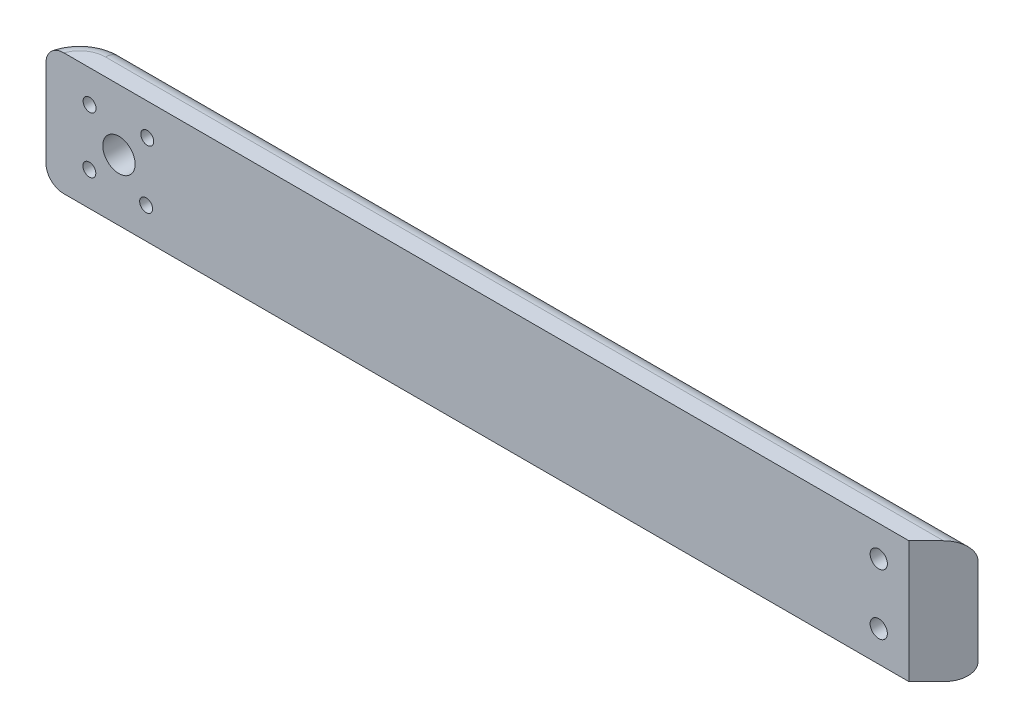
ISO-10303-21;
HEADER;
FILE_DESCRIPTION(('STEP AP214'),'2;1');
FILE_NAME('part.step','',(''),(''),'','','');
FILE_SCHEMA(('AUTOMOTIVE_DESIGN { 1 0 10303 214 1 1 1 1 }'));
ENDSEC;
DATA;
#1=APPLICATION_CONTEXT('core data for automotive mechanical design processes');
#2=APPLICATION_PROTOCOL_DEFINITION('international standard','automotive_design',2000,#1);
#3=PRODUCT_CONTEXT('',#1,'mechanical');
#4=PRODUCT('Part','Part','',(#3));
#5=PRODUCT_RELATED_PRODUCT_CATEGORY('part','',(#4));
#6=PRODUCT_DEFINITION_FORMATION('','',#4);
#7=PRODUCT_DEFINITION_CONTEXT('part definition',#1,'design');
#8=PRODUCT_DEFINITION('design','',#6,#7);
#9=PRODUCT_DEFINITION_SHAPE('','',#8);
#10=(LENGTH_UNIT() NAMED_UNIT(*) SI_UNIT(.MILLI.,.METRE.));
#11=(NAMED_UNIT(*) PLANE_ANGLE_UNIT() SI_UNIT($,.RADIAN.));
#12=(NAMED_UNIT(*) SI_UNIT($,.STERADIAN.) SOLID_ANGLE_UNIT());
#13=UNCERTAINTY_MEASURE_WITH_UNIT(LENGTH_MEASURE(1.E-05),#10,'distance_accuracy_value','');
#14=(GEOMETRIC_REPRESENTATION_CONTEXT(3) GLOBAL_UNCERTAINTY_ASSIGNED_CONTEXT((#13)) GLOBAL_UNIT_ASSIGNED_CONTEXT((#10,
#11,#12)) REPRESENTATION_CONTEXT('',''));
#15=CARTESIAN_POINT('',(0.,0.,0.));
#16=DIRECTION('',(0.,0.,1.));
#17=DIRECTION('',(1.,0.,0.));
#18=AXIS2_PLACEMENT_3D('',#15,#16,#17);
#19=CARTESIAN_POINT('',(0.,0.,8.));
#20=DIRECTION('',(0.,1.,0.));
#21=DIRECTION('',(0.,0.,1.));
#22=AXIS2_PLACEMENT_3D('',#19,#20,#21);
#23=PLANE('',#22);
#24=CARTESIAN_POINT('',(9.79795897113271,0.,10.));
#25=DIRECTION('',(0.,1.,0.));
#26=DIRECTION('',(0.,0.,1.));
#27=AXIS2_PLACEMENT_3D('',#24,#25,#26);
#28=CIRCLE('',#27,6.);
#29=CARTESIAN_POINT('',(4.14110472164033,0.,8.));
#30=VERTEX_POINT('',#29);
#31=CARTESIAN_POINT('',(9.79795897113271,0.,4.));
#32=VERTEX_POINT('',#31);
#33=EDGE_CURVE('E335',#30,#32,#28,.F.);
#34=ORIENTED_EDGE('',*,*,#33,.T.);
#35=DIRECTION('',(1.,0.,0.));
#36=VECTOR('',#35,1.);
#37=CARTESIAN_POINT('',(208.,0.,4.));
#38=LINE('',#37,#36);
#39=CARTESIAN_POINT('',(204.,0.,4.));
#40=VERTEX_POINT('',#39);
#41=EDGE_CURVE('E334',#32,#40,#38,.T.);
#42=ORIENTED_EDGE('',*,*,#41,.T.);
#43=DIRECTION('',(0.707106781186551,0.,-0.707106781186544));
#44=VECTOR('',#43,1.);
#45=CARTESIAN_POINT('',(200.,0.,8.));
#46=LINE('',#45,#44);
#47=CARTESIAN_POINT('',(200.,0.,8.));
#48=VERTEX_POINT('',#47);
#49=EDGE_CURVE('E142',#40,#48,#46,.F.);
#50=ORIENTED_EDGE('',*,*,#49,.T.);
#51=DIRECTION('',(1.,0.,0.));
#52=VECTOR('',#51,1.);
#53=CARTESIAN_POINT('',(0.,0.,8.));
#54=LINE('',#53,#52);
#55=EDGE_CURVE('E265',#30,#48,#54,.T.);
#56=ORIENTED_EDGE('',*,*,#55,.F.);
#57=EDGE_LOOP('',(#34,#42,#50,#56));
#58=FACE_BOUND('',#57,.T.);
#59=ADVANCED_FACE('F41',(#58),#23,.F.);
#60=CARTESIAN_POINT('',(0.,28.284,8.));
#61=DIRECTION('',(0.,-1.,0.));
#62=DIRECTION('',(0.,0.,-1.));
#63=AXIS2_PLACEMENT_3D('',#60,#61,#62);
#64=PLANE('',#63);
#65=DIRECTION('',(-0.707106781186551,0.,0.707106781186544));
#66=VECTOR('',#65,1.);
#67=CARTESIAN_POINT('',(200.,28.284,8.));
#68=LINE('',#67,#66);
#69=CARTESIAN_POINT('',(200.,28.284,8.));
#70=VERTEX_POINT('',#69);
#71=CARTESIAN_POINT('',(204.,28.284,4.));
#72=VERTEX_POINT('',#71);
#73=EDGE_CURVE('E250',#70,#72,#68,.F.);
#74=ORIENTED_EDGE('',*,*,#73,.T.);
#75=DIRECTION('',(-1.,0.,0.));
#76=VECTOR('',#75,1.);
#77=CARTESIAN_POINT('',(9.79795897113271,28.284,4.));
#78=LINE('',#77,#76);
#79=CARTESIAN_POINT('',(9.79795897113271,28.284,4.));
#80=VERTEX_POINT('',#79);
#81=EDGE_CURVE('E220',#72,#80,#78,.T.);
#82=ORIENTED_EDGE('',*,*,#81,.T.);
#83=CARTESIAN_POINT('',(9.79795897113271,28.284,10.));
#84=DIRECTION('',(0.,-1.,0.));
#85=DIRECTION('',(0.,0.,-1.));
#86=AXIS2_PLACEMENT_3D('',#83,#84,#85);
#87=CIRCLE('',#86,6.);
#88=CARTESIAN_POINT('',(4.14110472164033,28.284,8.));
#89=VERTEX_POINT('',#88);
#90=EDGE_CURVE('E224',#80,#89,#87,.F.);
#91=ORIENTED_EDGE('',*,*,#90,.T.);
#92=DIRECTION('',(-1.,0.,0.));
#93=VECTOR('',#92,1.);
#94=CARTESIAN_POINT('',(0.,28.284,8.));
#95=LINE('',#94,#93);
#96=EDGE_CURVE('E251',#70,#89,#95,.T.);
#97=ORIENTED_EDGE('',*,*,#96,.F.);
#98=EDGE_LOOP('',(#74,#82,#91,#97));
#99=FACE_BOUND('',#98,.T.);
#100=ADVANCED_FACE('F194',(#99),#64,.F.);
#101=CARTESIAN_POINT('',(0.,0.,8.));
#102=DIRECTION('',(0.,0.,-1.));
#103=DIRECTION('',(-1.,0.,0.));
#104=AXIS2_PLACEMENT_3D('',#101,#102,#103);
#105=PLANE('',#104);
#106=CARTESIAN_POINT('',(10.0957972659472,20.8451114749835,8.));
#107=DIRECTION('',(0.,0.,1.));
#108=DIRECTION('',(1.,0.,0.));
#109=AXIS2_PLACEMENT_3D('',#106,#107,#108);
#110=CIRCLE('',#109,1.5);
#111=CARTESIAN_POINT('',(11.5957972659472,20.8451114749835,8.));
#112=VERTEX_POINT('',#111);
#113=EDGE_CURVE('E304',#112,#112,#110,.T.);
#114=ORIENTED_EDGE('',*,*,#113,.F.);
#115=EDGE_LOOP('',(#114));
#116=FACE_BOUND('',#115,.T.);
#117=CARTESIAN_POINT('',(23.204777474584,7.2431956333157,8.));
#118=DIRECTION('',(0.,0.,1.));
#119=DIRECTION('',(1.,0.,0.));
#120=AXIS2_PLACEMENT_3D('',#117,#118,#119);
#121=CIRCLE('',#120,1.5);
#122=CARTESIAN_POINT('',(24.704777474584,7.2431956333157,8.));
#123=VERTEX_POINT('',#122);
#124=EDGE_CURVE('E132',#123,#123,#121,.T.);
#125=ORIENTED_EDGE('',*,*,#124,.F.);
#126=EDGE_LOOP('',(#125));
#127=FACE_BOUND('',#126,.T.);
#128=CARTESIAN_POINT('',(10.0393163578758,7.79979077293547,8.));
#129=DIRECTION('',(0.,0.,1.));
#130=DIRECTION('',(1.,0.,0.));
#131=AXIS2_PLACEMENT_3D('',#128,#129,#130);
#132=CIRCLE('',#131,1.5);
#133=CARTESIAN_POINT('',(11.5393163578758,7.79979077293547,8.));
#134=VERTEX_POINT('',#133);
#135=EDGE_CURVE('E133',#134,#134,#132,.T.);
#136=ORIENTED_EDGE('',*,*,#135,.F.);
#137=EDGE_LOOP('',(#136));
#138=FACE_BOUND('',#137,.T.);
#139=CARTESIAN_POINT('',(23.4605366557474,20.8833465869205,8.));
#140=DIRECTION('',(0.,0.,1.));
#141=DIRECTION('',(1.,0.,0.));
#142=AXIS2_PLACEMENT_3D('',#139,#140,#141);
#143=CIRCLE('',#142,1.5);
#144=CARTESIAN_POINT('',(24.9605366557474,20.8833465869205,8.));
#145=VERTEX_POINT('',#144);
#146=EDGE_CURVE('E229',#145,#145,#143,.T.);
#147=ORIENTED_EDGE('',*,*,#146,.F.);
#148=EDGE_LOOP('',(#147));
#149=FACE_BOUND('',#148,.T.);
#150=CARTESIAN_POINT('',(16.9034598118715,14.1779123336278,8.));
#151=DIRECTION('',(0.,0.,1.));
#152=DIRECTION('',(1.,0.,0.));
#153=AXIS2_PLACEMENT_3D('',#150,#151,#152);
#154=CIRCLE('',#153,3.75);
#155=CARTESIAN_POINT('',(20.6534598118715,14.1779123336278,8.));
#156=VERTEX_POINT('',#155);
#157=EDGE_CURVE('E289',#156,#156,#154,.T.);
#158=ORIENTED_EDGE('',*,*,#157,.F.);
#159=EDGE_LOOP('',(#158));
#160=FACE_BOUND('',#159,.T.);
#161=CARTESIAN_POINT('',(193.,7.142,8.));
#162=DIRECTION('',(0.,0.,1.));
#163=DIRECTION('',(1.,0.,0.));
#164=AXIS2_PLACEMENT_3D('',#161,#162,#163);
#165=CIRCLE('',#164,2.);
#166=CARTESIAN_POINT('',(195.,7.142,8.));
#167=VERTEX_POINT('',#166);
#168=EDGE_CURVE('E282',#167,#167,#165,.T.);
#169=ORIENTED_EDGE('',*,*,#168,.F.);
#170=EDGE_LOOP('',(#169));
#171=FACE_BOUND('',#170,.T.);
#172=CARTESIAN_POINT('',(193.,21.142,8.));
#173=DIRECTION('',(0.,0.,1.));
#174=DIRECTION('',(1.,0.,0.));
#175=AXIS2_PLACEMENT_3D('',#172,#173,#174);
#176=CIRCLE('',#175,2.);
#177=CARTESIAN_POINT('',(195.,21.142,8.));
#178=VERTEX_POINT('',#177);
#179=EDGE_CURVE('E273',#178,#178,#176,.T.);
#180=ORIENTED_EDGE('',*,*,#179,.F.);
#181=EDGE_LOOP('',(#180));
#182=FACE_BOUND('',#181,.T.);
#183=ORIENTED_EDGE('',*,*,#96,.T.);
#184=CARTESIAN_POINT('',(4.14110472164033,28.284,8.));
#185=CARTESIAN_POINT('',(4.01360111525839,28.2840203506575,8.));
#186=CARTESIAN_POINT('',(3.88607915052189,28.2785811784881,8.));
#187=CARTESIAN_POINT('',(3.63194361926597,28.2566783387421,8.));
#188=CARTESIAN_POINT('',(3.50533038346998,28.2402108446128,8.));
#189=CARTESIAN_POINT('',(3.25394305589581,28.1961274696758,8.));
#190=CARTESIAN_POINT('',(3.12917057763193,28.168502348132,8.));
#191=CARTESIAN_POINT('',(2.88262792845859,28.1021554149241,8.));
#192=CARTESIAN_POINT('',(2.76085725299349,28.063435482126,8.));
#193=CARTESIAN_POINT('',(2.52654222896296,27.9769774187968,8.));
#194=CARTESIAN_POINT('',(2.41382673962007,27.9297028630347,8.));
#195=CARTESIAN_POINT('',(2.19295864037752,27.8253752535569,8.));
#196=CARTESIAN_POINT('',(2.08480774415526,27.768318567339,8.));
#197=CARTESIAN_POINT('',(1.87417376086235,27.6448813827441,8.));
#198=CARTESIAN_POINT('',(1.77168265461272,27.5785145739187,8.));
#199=CARTESIAN_POINT('',(1.57303721170694,27.4368192047813,8.));
#200=CARTESIAN_POINT('',(1.47688498554711,27.3614876828992,8.));
#201=CARTESIAN_POINT('',(1.29660585092052,27.2065668171671,8.));
#202=CARTESIAN_POINT('',(1.2121137044245,27.1274020828302,8.));
#203=CARTESIAN_POINT('',(1.05028259435481,26.9620724660843,8.));
#204=CARTESIAN_POINT('',(0.972943340627988,26.8759078678876,8.));
#205=CARTESIAN_POINT('',(0.825997971624362,26.6971397796309,8.));
#206=CARTESIAN_POINT('',(0.756396076173939,26.6045328203393,8.));
#207=CARTESIAN_POINT('',(0.625563968280358,26.4136321504744,8.));
#208=CARTESIAN_POINT('',(0.564330576139064,26.3153406201281,8.));
#209=CARTESIAN_POINT('',(0.452301289673617,26.1166006487669,8.));
#210=CARTESIAN_POINT('',(0.401260883407848,26.0162899560909,8.));
#211=CARTESIAN_POINT('',(0.307950360694039,25.8117164188889,8.));
#212=CARTESIAN_POINT('',(0.265676704318534,25.7074551897431,8.));
#213=CARTESIAN_POINT('',(0.190235680641442,25.4957798570428,8.));
#214=CARTESIAN_POINT('',(0.157061254745993,25.3883682693448,8.));
#215=CARTESIAN_POINT('',(0.100045199069947,25.1711368331562,8.));
#216=CARTESIAN_POINT('',(0.0762001943311416,25.0613178707543,8.));
#217=CARTESIAN_POINT('',(0.0381075152402362,24.8405565782824,8.));
#218=CARTESIAN_POINT('',(0.0238155215375014,24.7296218939214,8.));
#219=CARTESIAN_POINT('',(0.00476308402525375,24.5071247305758,8.));
#220=CARTESIAN_POINT('',(-1.32878856208826E-05,24.3955636146889,8.));
#221=CARTESIAN_POINT('',(0.,24.284,8.));
#222=B_SPLINE_CURVE_WITH_KNOTS('',3,(#184,#185,#186,#187,#188,#189,#190,#191,#192,#193,#194,
#195,#196,#197,#198,#199,#200,#201,#202,#203,#204,#205,#206,#207,#208,#209,#210,#211,#212,#213,
#214,#215,#216,#217,#218,#219,#220,#221),.UNSPECIFIED.,.F.,.F.,(4,2,2,2,2,2,2,2,2,2,2,2,2,2,2,2,
2,2,4),(0.,0.382421742319619,0.764976244239279,1.14784822923239,1.530655414527,1.89687185159611,
2.26322457542097,2.62904415509928,2.99498492367341,3.3419117155038,3.68882442826248,
4.03592542270739,4.38289416372925,4.72013445893739,5.05723831353802,5.39407992041147,
5.73079956046903,6.06594600678909,6.40053098197907),.UNSPECIFIED.);
#223=CARTESIAN_POINT('',(0.,24.284,8.));
#224=VERTEX_POINT('',#223);
#225=EDGE_CURVE('E52',#89,#224,#222,.T.);
#226=ORIENTED_EDGE('',*,*,#225,.T.);
#227=DIRECTION('',(0.,-1.,0.));
#228=VECTOR('',#227,1.);
#229=CARTESIAN_POINT('',(0.,0.,8.));
#230=LINE('',#229,#228);
#231=CARTESIAN_POINT('',(0.,4.,8.));
#232=VERTEX_POINT('',#231);
#233=EDGE_CURVE('E269',#224,#232,#230,.T.);
#234=ORIENTED_EDGE('',*,*,#233,.T.);
#235=CARTESIAN_POINT('',(0.,4.,8.));
#236=CARTESIAN_POINT('',(-1.2762136588208E-05,3.88935858197723,8.));
#237=CARTESIAN_POINT('',(0.0046847248105545,3.77871958864574,8.));
#238=CARTESIAN_POINT('',(0.023407276534809,3.55824145891159,8.));
#239=CARTESIAN_POINT('',(0.0374316581693369,3.44840226452378,8.));
#240=CARTESIAN_POINT('',(0.0746930753427083,3.23043116733401,8.));
#241=CARTESIAN_POINT('',(0.0979192047724843,3.12229740041732,8.));
#242=CARTESIAN_POINT('',(0.153400860873408,2.90837507271076,8.));
#243=CARTESIAN_POINT('',(0.18565631782362,2.80258649381908,8.));
#244=CARTESIAN_POINT('',(0.258964778376081,2.59407545226469,8.));
#245=CARTESIAN_POINT('',(0.300019245168617,2.49135350279348,8.));
#246=CARTESIAN_POINT('',(0.390602925941773,2.28970426935192,8.));
#247=CARTESIAN_POINT('',(0.440135260838277,2.1907783992901,8.));
#248=CARTESIAN_POINT('',(0.600886795453445,1.90083312660584,8.));
#249=CARTESIAN_POINT('',(0.724343181534718,1.71641198738609,8.));
#250=CARTESIAN_POINT('',(1.00086672834877,1.36959461659217,8.));
#251=CARTESIAN_POINT('',(1.15411255909959,1.20734188044711,8.));
#252=CARTESIAN_POINT('',(1.48524864318383,0.910285259118014,8.));
#253=CARTESIAN_POINT('',(1.66314047634174,0.775483134904887,8.));
#254=CARTESIAN_POINT('',(2.04191596582885,0.534369372801414,8.));
#255=CARTESIAN_POINT('',(2.24316503022429,0.428632870049605,8.));
#256=CARTESIAN_POINT('',(2.66018746680216,0.25123310300499,8.));
#257=CARTESIAN_POINT('',(2.87596365117546,0.179576457739461,8.));
#258=CARTESIAN_POINT('',(3.26697279130985,0.0834395624075262,8.));
#259=CARTESIAN_POINT('',(3.44052971500507,0.0520059931675495,8.));
#260=CARTESIAN_POINT('',(3.70250626087917,0.0207190842763981,8.));
#261=CARTESIAN_POINT('',(3.79003654279109,0.0129339272146248,8.));
#262=CARTESIAN_POINT('',(3.96540835510236,0.00257337907875281,8.));
#263=CARTESIAN_POINT('',(4.05324989513215,-1.84936306332413E-06,8.));
#264=CARTESIAN_POINT('',(4.14110472164033,0.,8.));
#265=B_SPLINE_CURVE_WITH_KNOTS('',3,(#235,#236,#237,#238,#239,#240,#241,#242,#243,#244,#245,
#246,#247,#248,#249,#250,#251,#252,#253,#254,#255,#256,#257,#258,#259,#260,#261,#262,#263,#264),
.UNSPECIFIED.,.F.,.F.,(4,2,2,2,2,2,2,2,2,2,2,2,2,2,4),(0.,0.33182094496395,0.663617588586055,
0.995022150551299,1.32642415361069,1.65788130843713,1.98946074442714,2.65188420765348,
3.31841065959656,3.98497985609484,4.66391890397689,5.34298976234982,5.87078845025596,
6.1342779727024,6.39777572006791),.UNSPECIFIED.);
#266=EDGE_CURVE('E199',#232,#30,#265,.T.);
#267=ORIENTED_EDGE('',*,*,#266,.T.);
#268=ORIENTED_EDGE('',*,*,#55,.T.);
#269=DIRECTION('',(0.,1.,0.));
#270=VECTOR('',#269,1.);
#271=CARTESIAN_POINT('',(200.,0.,8.));
#272=LINE('',#271,#270);
#273=EDGE_CURVE('E257',#48,#70,#272,.T.);
#274=ORIENTED_EDGE('',*,*,#273,.T.);
#275=EDGE_LOOP('',(#183,#226,#234,#267,#268,#274));
#276=FACE_BOUND('',#275,.T.);
#277=ADVANCED_FACE('F190',(#116,#127,#138,#149,#160,#171,#182,#276),#105,.F.);
#278=CARTESIAN_POINT('',(0.,0.,0.));
#279=DIRECTION('',(0.,0.,-1.));
#280=DIRECTION('',(-1.,0.,0.));
#281=AXIS2_PLACEMENT_3D('',#278,#279,#280);
#282=PLANE('',#281);
#283=DIRECTION('',(0.,-1.,0.));
#284=VECTOR('',#283,1.);
#285=CARTESIAN_POINT('',(9.79795897113271,28.284,0.));
#286=LINE('',#285,#284);
#287=CARTESIAN_POINT('',(9.79795897113271,22.3152449213556,0.));
#288=VERTEX_POINT('',#287);
#289=CARTESIAN_POINT('',(9.79795897113271,24.284,0.));
#290=VERTEX_POINT('',#289);
#291=EDGE_CURVE('E138',#288,#290,#286,.F.);
#292=ORIENTED_EDGE('',*,*,#291,.T.);
#293=DIRECTION('',(-1.,0.,0.));
#294=VECTOR('',#293,1.);
#295=CARTESIAN_POINT('',(208.,24.284,0.));
#296=LINE('',#295,#294);
#297=CARTESIAN_POINT('',(208.,24.284,0.));
#298=VERTEX_POINT('',#297);
#299=EDGE_CURVE('E217',#290,#298,#296,.F.);
#300=ORIENTED_EDGE('',*,*,#299,.T.);
#301=DIRECTION('',(0.,1.,0.));
#302=VECTOR('',#301,1.);
#303=CARTESIAN_POINT('',(208.,0.,0.));
#304=LINE('',#303,#302);
#305=CARTESIAN_POINT('',(208.,4.,0.));
#306=VERTEX_POINT('',#305);
#307=EDGE_CURVE('E256',#298,#306,#304,.F.);
#308=ORIENTED_EDGE('',*,*,#307,.T.);
#309=DIRECTION('',(1.,0.,0.));
#310=VECTOR('',#309,1.);
#311=CARTESIAN_POINT('',(9.79795897113271,4.,0.));
#312=LINE('',#311,#310);
#313=CARTESIAN_POINT('',(9.79795897113271,4.,0.));
#314=VERTEX_POINT('',#313);
#315=EDGE_CURVE('E340',#306,#314,#312,.F.);
#316=ORIENTED_EDGE('',*,*,#315,.T.);
#317=CARTESIAN_POINT('',(9.79795897113271,6.3193359063946,0.));
#318=VERTEX_POINT('',#317);
#319=EDGE_CURVE('E123',#314,#318,#286,.F.);
#320=ORIENTED_EDGE('',*,*,#319,.T.);
#321=CARTESIAN_POINT('',(10.0393163578758,7.79979077293547,0.));
#322=DIRECTION('',(0.,0.,1.));
#323=DIRECTION('',(1.,0.,0.));
#324=AXIS2_PLACEMENT_3D('',#321,#322,#323);
#325=CIRCLE('',#324,1.5);
#326=CARTESIAN_POINT('',(9.79795897113271,9.28024563947634,0.));
#327=VERTEX_POINT('',#326);
#328=EDGE_CURVE('E118',#318,#327,#325,.T.);
#329=ORIENTED_EDGE('',*,*,#328,.T.);
#330=CARTESIAN_POINT('',(9.79795897113271,19.3749780286113,0.));
#331=VERTEX_POINT('',#330);
#332=EDGE_CURVE('E130',#327,#331,#286,.F.);
#333=ORIENTED_EDGE('',*,*,#332,.T.);
#334=CARTESIAN_POINT('',(10.0957972659472,20.8451114749835,0.));
#335=DIRECTION('',(0.,0.,1.));
#336=DIRECTION('',(1.,0.,0.));
#337=AXIS2_PLACEMENT_3D('',#334,#335,#336);
#338=CIRCLE('',#337,1.5);
#339=EDGE_CURVE('E293',#331,#288,#338,.T.);
#340=ORIENTED_EDGE('',*,*,#339,.T.);
#341=EDGE_LOOP('',(#292,#300,#308,#316,#320,#329,#333,#340));
#342=FACE_BOUND('',#341,.T.);
#343=CARTESIAN_POINT('',(23.204777474584,7.2431956333157,0.));
#344=DIRECTION('',(0.,0.,1.));
#345=DIRECTION('',(1.,0.,0.));
#346=AXIS2_PLACEMENT_3D('',#343,#344,#345);
#347=CIRCLE('',#346,1.5);
#348=CARTESIAN_POINT('',(24.704777474584,7.2431956333157,0.));
#349=VERTEX_POINT('',#348);
#350=EDGE_CURVE('E300',#349,#349,#347,.T.);
#351=ORIENTED_EDGE('',*,*,#350,.T.);
#352=EDGE_LOOP('',(#351));
#353=FACE_BOUND('',#352,.T.);
#354=CARTESIAN_POINT('',(23.4605366557474,20.8833465869205,0.));
#355=DIRECTION('',(0.,0.,1.));
#356=DIRECTION('',(1.,0.,0.));
#357=AXIS2_PLACEMENT_3D('',#354,#355,#356);
#358=CIRCLE('',#357,1.5);
#359=CARTESIAN_POINT('',(24.9605366557474,20.8833465869205,0.));
#360=VERTEX_POINT('',#359);
#361=EDGE_CURVE('E237',#360,#360,#358,.T.);
#362=ORIENTED_EDGE('',*,*,#361,.T.);
#363=EDGE_LOOP('',(#362));
#364=FACE_BOUND('',#363,.T.);
#365=CARTESIAN_POINT('',(16.9034598118715,14.1779123336278,0.));
#366=DIRECTION('',(0.,0.,1.));
#367=DIRECTION('',(1.,0.,0.));
#368=AXIS2_PLACEMENT_3D('',#365,#366,#367);
#369=CIRCLE('',#368,3.75);
#370=CARTESIAN_POINT('',(20.6534598118715,14.1779123336278,0.));
#371=VERTEX_POINT('',#370);
#372=EDGE_CURVE('E278',#371,#371,#369,.T.);
#373=ORIENTED_EDGE('',*,*,#372,.T.);
#374=EDGE_LOOP('',(#373));
#375=FACE_BOUND('',#374,.T.);
#376=CARTESIAN_POINT('',(193.,7.142,0.));
#377=DIRECTION('',(0.,0.,1.));
#378=DIRECTION('',(1.,0.,0.));
#379=AXIS2_PLACEMENT_3D('',#376,#377,#378);
#380=CIRCLE('',#379,2.);
#381=CARTESIAN_POINT('',(195.,7.142,0.));
#382=VERTEX_POINT('',#381);
#383=EDGE_CURVE('E272',#382,#382,#380,.T.);
#384=ORIENTED_EDGE('',*,*,#383,.T.);
#385=EDGE_LOOP('',(#384));
#386=FACE_BOUND('',#385,.T.);
#387=CARTESIAN_POINT('',(193.,21.142,0.));
#388=DIRECTION('',(0.,0.,1.));
#389=DIRECTION('',(1.,0.,0.));
#390=AXIS2_PLACEMENT_3D('',#387,#388,#389);
#391=CIRCLE('',#390,2.);
#392=CARTESIAN_POINT('',(195.,21.142,0.));
#393=VERTEX_POINT('',#392);
#394=EDGE_CURVE('E277',#393,#393,#391,.T.);
#395=ORIENTED_EDGE('',*,*,#394,.T.);
#396=EDGE_LOOP('',(#395));
#397=FACE_BOUND('',#396,.T.);
#398=ADVANCED_FACE('F127',(#342,#353,#364,#375,#386,#397),#282,.T.);
#399=CARTESIAN_POINT('',(200.,0.,8.));
#400=DIRECTION('',(-0.707106781186544,0.,-0.707106781186551));
#401=DIRECTION('',(0.,1.,0.));
#402=AXIS2_PLACEMENT_3D('',#399,#400,#401);
#403=PLANE('',#402);
#404=ORIENTED_EDGE('',*,*,#307,.F.);
#405=CARTESIAN_POINT('',(204.,24.284,4.));
#406=DIRECTION('',(-0.707106781186544,0.,-0.707106781186551));
#407=DIRECTION('',(0.707106781186551,0.,-0.707106781186544));
#408=AXIS2_PLACEMENT_3D('',#405,#406,#407);
#409=ELLIPSE('',#408,5.65685424949241,4.);
#410=EDGE_CURVE('E214',#298,#72,#409,.F.);
#411=ORIENTED_EDGE('',*,*,#410,.T.);
#412=ORIENTED_EDGE('',*,*,#73,.F.);
#413=ORIENTED_EDGE('',*,*,#273,.F.);
#414=ORIENTED_EDGE('',*,*,#49,.F.);
#415=CARTESIAN_POINT('',(204.,4.,4.));
#416=DIRECTION('',(-0.707106781186544,0.,-0.707106781186551));
#417=DIRECTION('',(-0.707106781186551,0.,0.707106781186544));
#418=AXIS2_PLACEMENT_3D('',#415,#416,#417);
#419=ELLIPSE('',#418,5.65685424949241,4.);
#420=EDGE_CURVE('E329',#40,#306,#419,.F.);
#421=ORIENTED_EDGE('',*,*,#420,.T.);
#422=EDGE_LOOP('',(#404,#411,#412,#413,#414,#421));
#423=FACE_BOUND('',#422,.T.);
#424=ADVANCED_FACE('F188',(#423),#403,.F.);
#425=CARTESIAN_POINT('',(193.,21.142,0.));
#426=DIRECTION('',(0.,0.,1.));
#427=DIRECTION('',(1.,0.,0.));
#428=AXIS2_PLACEMENT_3D('',#425,#426,#427);
#429=CYLINDRICAL_SURFACE('',#428,2.);
#430=ORIENTED_EDGE('',*,*,#394,.F.);
#431=EDGE_LOOP('',(#430));
#432=FACE_BOUND('',#431,.T.);
#433=ORIENTED_EDGE('',*,*,#179,.T.);
#434=EDGE_LOOP('',(#433));
#435=FACE_BOUND('',#434,.T.);
#436=ADVANCED_FACE('F184',(#432,#435),#429,.F.);
#437=CARTESIAN_POINT('',(193.,7.142,0.));
#438=DIRECTION('',(0.,0.,1.));
#439=DIRECTION('',(1.,0.,0.));
#440=AXIS2_PLACEMENT_3D('',#437,#438,#439);
#441=CYLINDRICAL_SURFACE('',#440,2.);
#442=ORIENTED_EDGE('',*,*,#383,.F.);
#443=EDGE_LOOP('',(#442));
#444=FACE_BOUND('',#443,.T.);
#445=ORIENTED_EDGE('',*,*,#168,.T.);
#446=EDGE_LOOP('',(#445));
#447=FACE_BOUND('',#446,.T.);
#448=ADVANCED_FACE('F181',(#444,#447),#441,.F.);
#449=CARTESIAN_POINT('',(9.79795897113271,0.,10.));
#450=DIRECTION('',(0.,1.,0.));
#451=DIRECTION('',(0.,0.,1.));
#452=AXIS2_PLACEMENT_3D('',#449,#450,#451);
#453=CYLINDRICAL_SURFACE('',#452,10.);
#454=ORIENTED_EDGE('',*,*,#233,.F.);
#455=CARTESIAN_POINT('',(9.79795897113271,24.284,10.));
#456=DIRECTION('',(0.,-1.,0.));
#457=DIRECTION('',(0.,0.,-1.));
#458=AXIS2_PLACEMENT_3D('',#455,#456,#457);
#459=CIRCLE('',#458,10.);
#460=EDGE_CURVE('E11',#224,#290,#459,.T.);
#461=ORIENTED_EDGE('',*,*,#460,.T.);
#462=ORIENTED_EDGE('',*,*,#291,.F.);
#463=CARTESIAN_POINT('',(9.79795897113272,19.3749780286113,0.));
#464=CARTESIAN_POINT('',(9.75675594147695,19.3833255005895,-1.35267394674382E-06));
#465=CARTESIAN_POINT('',(9.715924253105,19.3934020603461,0.000254923013555084));
#466=CARTESIAN_POINT('',(9.63525881554064,19.4169409316826,0.0012425119752557));
#467=CARTESIAN_POINT('',(9.59542497155413,19.430402920299,0.00197377994661821));
#468=CARTESIAN_POINT('',(9.47794284928967,19.4757028720142,0.00481616756848514));
#469=CARTESIAN_POINT('',(9.40215281710426,19.5124876570626,0.00757617956985924));
#470=CARTESIAN_POINT('',(9.25784509959741,19.5981593947917,0.0143344794473673));
#471=CARTESIAN_POINT('',(9.18932927869286,19.6470494394633,0.018333083757069));
#472=CARTESIAN_POINT('',(9.06143728126594,19.7555575497611,0.0269539938270927));
#473=CARTESIAN_POINT('',(9.00206057937058,19.8151749982822,0.0315762637065783));
#474=CARTESIAN_POINT('',(8.89378287703584,19.9438495568668,0.0408110607527985));
#475=CARTESIAN_POINT('',(8.84494332682748,20.0129583864329,0.0454233832732962));
#476=CARTESIAN_POINT('',(8.75953733490126,20.1584354675755,0.0539691496186258));
#477=CARTESIAN_POINT('',(8.72297231478574,20.2348045587021,0.0579025147828722));
#478=CARTESIAN_POINT('',(8.6631731265466,20.3926599990048,0.0645497115139229));
#479=CARTESIAN_POINT('',(8.63994080687245,20.4741470560006,0.0672633739694871));
#480=CARTESIAN_POINT('',(8.60750384797732,20.6398975347003,0.0710983945968404));
#481=CARTESIAN_POINT('',(8.59829778912771,20.7241606745486,0.0722199139121446));
#482=CARTESIAN_POINT('',(8.59419912226062,20.8924839811918,0.0727160632791052));
#483=CARTESIAN_POINT('',(8.59921294351324,20.9765418488477,0.0721021132854488));
#484=CARTESIAN_POINT('',(8.62320373393818,21.1426133436642,0.069234997269021));
#485=CARTESIAN_POINT('',(8.64218109999207,21.2246269126518,0.066981784654008));
#486=CARTESIAN_POINT('',(8.69351628104054,21.3842099222045,0.0611435421844135));
#487=CARTESIAN_POINT('',(8.72586080555981,21.4617836901264,0.0575598355499999));
#488=CARTESIAN_POINT('',(8.80300135247044,21.6104147680044,0.0495449403040396));
#489=CARTESIAN_POINT('',(8.847796719891,21.6814724204763,0.0451137962753666));
#490=CARTESIAN_POINT('',(8.94890225805331,21.8155365045546,0.0359803319394664));
#491=CARTESIAN_POINT('',(9.00528197165614,21.8784903906197,0.0312765031784171));
#492=CARTESIAN_POINT('',(9.12785009127222,21.9941010579366,0.0222887913175643));
#493=CARTESIAN_POINT('',(9.19404351410049,22.0467525404258,0.0180051248787788));
#494=CARTESIAN_POINT('',(9.33456483251032,22.1403638875535,0.0104939231875205));
#495=CARTESIAN_POINT('',(9.40891617198382,22.1812887676902,0.00726954404691779));
#496=CARTESIAN_POINT('',(9.56337620368519,22.249974560977,0.00245553680007324));
#497=CARTESIAN_POINT('',(9.64347149397507,22.277765038165,0.000862227816583014));
#498=CARTESIAN_POINT('',(9.74934386705534,22.3047677882936,8.81788117033983E-05));
#499=CARTESIAN_POINT('',(9.77359522354769,22.3103131965692,-1.53817527668337E-06));
#500=CARTESIAN_POINT('',(9.79795897113272,22.3152449213556,0.));
#501=B_SPLINE_CURVE_WITH_KNOTS('',3,(#463,#464,#465,#466,#467,#468,#469,#470,#471,#472,#473,
#474,#475,#476,#477,#478,#479,#480,#481,#482,#483,#484,#485,#486,#487,#488,#489,#490,#491,#492,
#493,#494,#495,#496,#497,#498,#499,#500),.UNSPECIFIED.,.F.,.F.,(4,2,2,2,2,2,2,2,2,2,2,2,2,2,2,2,
2,2,4),(0.,0.126041660750272,0.252071301923282,0.503643492374299,0.755280007166486,
1.00690205093087,1.25995404382936,1.5130353344109,1.76615170378511,2.01924245299417,
2.27067166679926,2.52210802717634,2.7732949927593,3.02446874726876,3.27719686885046,
3.53005463459895,3.78365908979972,4.0366899592798,4.11128788413294),.UNSPECIFIED.);
#502=EDGE_CURVE('E122',#331,#288,#501,.T.);
#503=ORIENTED_EDGE('',*,*,#502,.F.);
#504=ORIENTED_EDGE('',*,*,#332,.F.);
#505=CARTESIAN_POINT('',(9.79795897113272,6.3193359063946,0.));
#506=CARTESIAN_POINT('',(9.75648339136793,6.32609766628864,-1.39319397487049E-06));
#507=CARTESIAN_POINT('',(9.71531243481764,6.33460008133926,0.000258317588893078));
#508=CARTESIAN_POINT('',(9.63383756684147,6.35502356629039,0.0012641007414514));
#509=CARTESIAN_POINT('',(9.59353357338378,6.36694431120629,0.00201012688515333));
#510=CARTESIAN_POINT('',(9.47445267351396,6.40768920452869,0.00492019113884442));
#511=CARTESIAN_POINT('',(9.397342315935,6.4415230226027,0.00775649381558685));
#512=CARTESIAN_POINT('',(9.24992219488782,6.52154850665795,0.0147547581572732));
#513=CARTESIAN_POINT('',(9.17961416474097,6.56774331114608,0.0189170565493699));
#514=CARTESIAN_POINT('',(9.04771320651457,6.67118821367901,0.0279638914990749));
#515=CARTESIAN_POINT('',(8.98611985242836,6.72843777100151,0.0328483927287625));
#516=CARTESIAN_POINT('',(8.87300796672594,6.85277852455666,0.042705308805963));
#517=CARTESIAN_POINT('',(8.82155236479265,6.91992693254684,0.047678076003772));
#518=CARTESIAN_POINT('',(8.73061646000746,7.06194629361167,0.0570187208004589));
#519=CARTESIAN_POINT('',(8.69113760577471,7.13681817939483,0.0613865251927999));
#520=CARTESIAN_POINT('',(8.62526707585635,7.29225224194178,0.0689426343644811));
#521=CARTESIAN_POINT('',(8.59888724338255,7.3728194931578,0.0721298710988803));
#522=CARTESIAN_POINT('',(8.56005051347752,7.5372830122535,0.076897165515093));
#523=CARTESIAN_POINT('',(8.54759217671116,7.62117893505489,0.0784773893434916));
#524=CARTESIAN_POINT('',(8.53700702559148,7.78928976063817,0.0798170846967796));
#525=CARTESIAN_POINT('',(8.53877991500148,7.87349825768905,0.0795892985117063));
#526=CARTESIAN_POINT('',(8.55636539953785,8.04041261676594,0.0773732254193972));
#527=CARTESIAN_POINT('',(8.5721780993847,8.12311846757927,0.075384925380799));
#528=CARTESIAN_POINT('',(8.61732304321872,8.2844969797055,0.0699139131495355));
#529=CARTESIAN_POINT('',(8.64662476586051,8.36317830300845,0.0664345759188733));
#530=CARTESIAN_POINT('',(8.71789281513957,8.51451866617862,0.0584339165808677));
#531=CARTESIAN_POINT('',(8.75985920387356,8.58717767651532,0.0539125893645201));
#532=CARTESIAN_POINT('',(8.85558598607889,8.72491883442741,0.0443857828525176));
#533=CARTESIAN_POINT('',(8.90942012902918,8.78994952394942,0.0393773906772923));
#534=CARTESIAN_POINT('',(9.02724744399411,8.91010466561796,0.0295692451227601));
#535=CARTESIAN_POINT('',(9.09124354506166,8.96522625179687,0.0247695524080311));
#536=CARTESIAN_POINT('',(9.22789221308893,9.0642052134727,0.0160263721862195));
#537=CARTESIAN_POINT('',(9.30058127978732,9.10801246675002,0.0120867061007053));
#538=CARTESIAN_POINT('',(9.45230410065512,9.18273872295902,0.00568878817869454));
#539=CARTESIAN_POINT('',(9.53132887202203,9.21367560124386,0.00322847956758065));
#540=CARTESIAN_POINT('',(9.64278919170188,9.24678170366125,0.0011569622482833));
#541=CARTESIAN_POINT('',(9.67354803912115,9.25486001920506,0.000725807225428657));
#542=CARTESIAN_POINT('',(9.73546604040937,9.26903527415365,0.000147537904186564));
#543=CARTESIAN_POINT('',(9.7666244164424,9.27513559110882,-6.27260408099018E-08));
#544=CARTESIAN_POINT('',(9.79795897113271,9.28024563947634,0.));
#545=B_SPLINE_CURVE_WITH_KNOTS('',3,(#505,#506,#507,#508,#509,#510,#511,#512,#513,#514,#515,
#516,#517,#518,#519,#520,#521,#522,#523,#524,#525,#526,#527,#528,#529,#530,#531,#532,#533,#534,
#535,#536,#537,#538,#539,#540,#541,#542,#543,#544),.UNSPECIFIED.,.F.,.F.,(4,2,2,2,2,2,2,2,2,2,2,
2,2,2,2,2,2,2,2,4),(0.,0.125990906128136,0.251969838122676,0.503433920406739,0.754961911171483,
1.00647760203598,1.25950851218143,1.51257001489044,1.76585990324764,2.01912360169089,
2.2706039699248,2.52208621392222,2.77300220987561,3.02391943612691,3.27644223821617,
3.52903795930053,3.7827341895245,4.036076881272,4.13144078610123,4.2266409831685),.UNSPECIFIED.);
#546=EDGE_CURVE('E114',#318,#327,#545,.T.);
#547=ORIENTED_EDGE('',*,*,#546,.F.);
#548=ORIENTED_EDGE('',*,*,#319,.F.);
#549=CARTESIAN_POINT('',(9.79795897113271,4.,10.));
#550=DIRECTION('',(0.,1.,0.));
#551=DIRECTION('',(0.,0.,1.));
#552=AXIS2_PLACEMENT_3D('',#549,#550,#551);
#553=CIRCLE('',#552,10.);
#554=EDGE_CURVE('E344',#314,#232,#553,.T.);
#555=ORIENTED_EDGE('',*,*,#554,.T.);
#556=EDGE_LOOP('',(#454,#461,#462,#503,#504,#547,#548,#555));
#557=FACE_BOUND('',#556,.T.);
#558=ADVANCED_FACE('F136',(#557),#453,.T.);
#559=CARTESIAN_POINT('',(10.0393163578758,7.79979077293547,0.));
#560=DIRECTION('',(0.,0.,1.));
#561=DIRECTION('',(1.,0.,0.));
#562=AXIS2_PLACEMENT_3D('',#559,#560,#561);
#563=CYLINDRICAL_SURFACE('',#562,1.5);
#564=ORIENTED_EDGE('',*,*,#546,.T.);
#565=ORIENTED_EDGE('',*,*,#328,.F.);
#566=EDGE_LOOP('',(#564,#565));
#567=FACE_BOUND('',#566,.T.);
#568=ORIENTED_EDGE('',*,*,#135,.T.);
#569=EDGE_LOOP('',(#568));
#570=FACE_BOUND('',#569,.T.);
#571=ADVANCED_FACE('F116',(#567,#570),#563,.F.);
#572=CARTESIAN_POINT('',(10.0957972659472,20.8451114749835,0.));
#573=DIRECTION('',(0.,0.,1.));
#574=DIRECTION('',(1.,0.,0.));
#575=AXIS2_PLACEMENT_3D('',#572,#573,#574);
#576=CYLINDRICAL_SURFACE('',#575,1.5);
#577=ORIENTED_EDGE('',*,*,#502,.T.);
#578=ORIENTED_EDGE('',*,*,#339,.F.);
#579=EDGE_LOOP('',(#577,#578));
#580=FACE_BOUND('',#579,.T.);
#581=ORIENTED_EDGE('',*,*,#113,.T.);
#582=EDGE_LOOP('',(#581));
#583=FACE_BOUND('',#582,.T.);
#584=ADVANCED_FACE('F164',(#580,#583),#576,.F.);
#585=CARTESIAN_POINT('',(16.9034598118715,14.1779123336278,0.));
#586=DIRECTION('',(0.,0.,1.));
#587=DIRECTION('',(1.,0.,0.));
#588=AXIS2_PLACEMENT_3D('',#585,#586,#587);
#589=CYLINDRICAL_SURFACE('',#588,3.75);
#590=ORIENTED_EDGE('',*,*,#372,.F.);
#591=EDGE_LOOP('',(#590));
#592=FACE_BOUND('',#591,.T.);
#593=ORIENTED_EDGE('',*,*,#157,.T.);
#594=EDGE_LOOP('',(#593));
#595=FACE_BOUND('',#594,.T.);
#596=ADVANCED_FACE('F168',(#592,#595),#589,.F.);
#597=CARTESIAN_POINT('',(23.4605366557474,20.8833465869205,0.));
#598=DIRECTION('',(0.,0.,1.));
#599=DIRECTION('',(1.,0.,0.));
#600=AXIS2_PLACEMENT_3D('',#597,#598,#599);
#601=CYLINDRICAL_SURFACE('',#600,1.5);
#602=ORIENTED_EDGE('',*,*,#361,.F.);
#603=EDGE_LOOP('',(#602));
#604=FACE_BOUND('',#603,.T.);
#605=ORIENTED_EDGE('',*,*,#146,.T.);
#606=EDGE_LOOP('',(#605));
#607=FACE_BOUND('',#606,.T.);
#608=ADVANCED_FACE('F165',(#604,#607),#601,.F.);
#609=CARTESIAN_POINT('',(23.204777474584,7.2431956333157,0.));
#610=DIRECTION('',(0.,0.,1.));
#611=DIRECTION('',(1.,0.,0.));
#612=AXIS2_PLACEMENT_3D('',#609,#610,#611);
#613=CYLINDRICAL_SURFACE('',#612,1.5);
#614=ORIENTED_EDGE('',*,*,#350,.F.);
#615=EDGE_LOOP('',(#614));
#616=FACE_BOUND('',#615,.T.);
#617=ORIENTED_EDGE('',*,*,#124,.T.);
#618=EDGE_LOOP('',(#617));
#619=FACE_BOUND('',#618,.T.);
#620=ADVANCED_FACE('F167',(#616,#619),#613,.F.);
#621=CARTESIAN_POINT('',(9.79795897113271,4.,10.));
#622=DIRECTION('',(0.,1.,0.));
#623=DIRECTION('',(0.,0.,1.));
#624=AXIS2_PLACEMENT_3D('',#621,#622,#623);
#625=TOROIDAL_SURFACE('',#624,6.,4.);
#626=ORIENTED_EDGE('',*,*,#266,.F.);
#627=ORIENTED_EDGE('',*,*,#554,.F.);
#628=CARTESIAN_POINT('',(9.79795897113271,4.,4.));
#629=DIRECTION('',(1.,0.,0.));
#630=DIRECTION('',(0.,0.,-1.));
#631=AXIS2_PLACEMENT_3D('',#628,#629,#630);
#632=CIRCLE('',#631,4.);
#633=EDGE_CURVE('E226',#32,#314,#632,.T.);
#634=ORIENTED_EDGE('',*,*,#633,.F.);
#635=ORIENTED_EDGE('',*,*,#33,.F.);
#636=EDGE_LOOP('',(#626,#627,#634,#635));
#637=FACE_BOUND('',#636,.T.);
#638=ADVANCED_FACE('F176',(#637),#625,.T.);
#639=CARTESIAN_POINT('',(0.,4.,4.));
#640=DIRECTION('',(-1.,0.,0.));
#641=DIRECTION('',(0.,0.,1.));
#642=AXIS2_PLACEMENT_3D('',#639,#640,#641);
#643=CYLINDRICAL_SURFACE('',#642,4.);
#644=ORIENTED_EDGE('',*,*,#633,.T.);
#645=ORIENTED_EDGE('',*,*,#315,.F.);
#646=ORIENTED_EDGE('',*,*,#420,.F.);
#647=ORIENTED_EDGE('',*,*,#41,.F.);
#648=EDGE_LOOP('',(#644,#645,#646,#647));
#649=FACE_BOUND('',#648,.T.);
#650=ADVANCED_FACE('F352',(#649),#643,.T.);
#651=CARTESIAN_POINT('',(9.79795897113271,24.284,10.));
#652=DIRECTION('',(0.,-1.,0.));
#653=DIRECTION('',(0.,0.,-1.));
#654=AXIS2_PLACEMENT_3D('',#651,#652,#653);
#655=TOROIDAL_SURFACE('',#654,6.,4.);
#656=ORIENTED_EDGE('',*,*,#225,.F.);
#657=ORIENTED_EDGE('',*,*,#90,.F.);
#658=CARTESIAN_POINT('',(9.79795897113271,24.284,4.));
#659=DIRECTION('',(1.,0.,0.));
#660=DIRECTION('',(0.,0.,-1.));
#661=AXIS2_PLACEMENT_3D('',#658,#659,#660);
#662=CIRCLE('',#661,4.);
#663=EDGE_CURVE('E46',#290,#80,#662,.T.);
#664=ORIENTED_EDGE('',*,*,#663,.F.);
#665=ORIENTED_EDGE('',*,*,#460,.F.);
#666=EDGE_LOOP('',(#656,#657,#664,#665));
#667=FACE_BOUND('',#666,.T.);
#668=ADVANCED_FACE('F43',(#667),#655,.T.);
#669=CARTESIAN_POINT('',(0.,24.284,4.));
#670=DIRECTION('',(1.,0.,0.));
#671=DIRECTION('',(0.,0.,-1.));
#672=AXIS2_PLACEMENT_3D('',#669,#670,#671);
#673=CYLINDRICAL_SURFACE('',#672,4.);
#674=ORIENTED_EDGE('',*,*,#410,.F.);
#675=ORIENTED_EDGE('',*,*,#299,.F.);
#676=ORIENTED_EDGE('',*,*,#663,.T.);
#677=ORIENTED_EDGE('',*,*,#81,.F.);
#678=EDGE_LOOP('',(#674,#675,#676,#677));
#679=FACE_BOUND('',#678,.T.);
#680=ADVANCED_FACE('F245',(#679),#673,.T.);
#681=CLOSED_SHELL('',(#59,#100,#277,#398,#424,#436,#448,#558,#571,#584,#596,#608,#620,#638,#650,
#668,#680));
#682=MANIFOLD_SOLID_BREP('B2',#681);
#683=ADVANCED_BREP_SHAPE_REPRESENTATION('',(#18,#682),#14);
#684=SHAPE_DEFINITION_REPRESENTATION(#9,#683);
ENDSEC;
END-ISO-10303-21;
